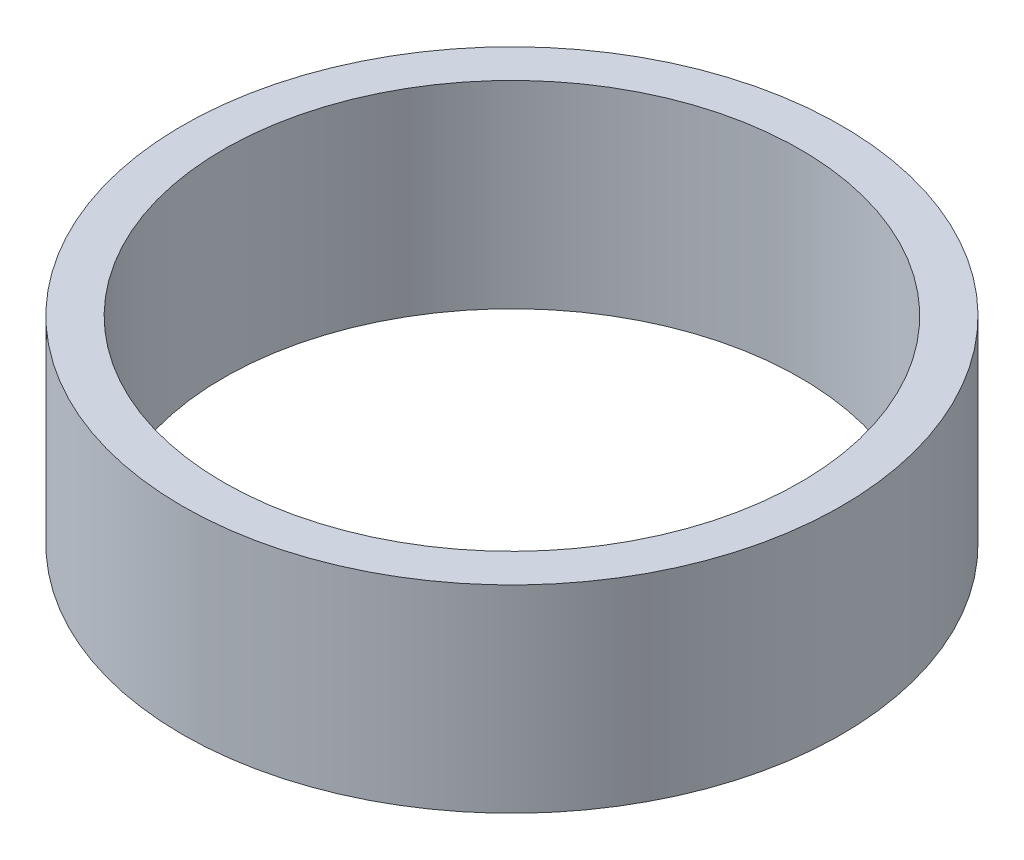
ISO-10303-21;
HEADER;
FILE_DESCRIPTION(('STEP AP214'),'2;1');
FILE_NAME('part.step','',(''),(''),'','','');
FILE_SCHEMA(('AUTOMOTIVE_DESIGN { 1 0 10303 214 1 1 1 1 }'));
ENDSEC;
DATA;
#1=APPLICATION_CONTEXT('core data for automotive mechanical design processes');
#2=APPLICATION_PROTOCOL_DEFINITION('international standard','automotive_design',2000,#1);
#3=PRODUCT_CONTEXT('',#1,'mechanical');
#4=PRODUCT('Part','Part','',(#3));
#5=PRODUCT_RELATED_PRODUCT_CATEGORY('part','',(#4));
#6=PRODUCT_DEFINITION_FORMATION('','',#4);
#7=PRODUCT_DEFINITION_CONTEXT('part definition',#1,'design');
#8=PRODUCT_DEFINITION('design','',#6,#7);
#9=PRODUCT_DEFINITION_SHAPE('','',#8);
#10=(LENGTH_UNIT() NAMED_UNIT(*) SI_UNIT(.MILLI.,.METRE.));
#11=(NAMED_UNIT(*) PLANE_ANGLE_UNIT() SI_UNIT($,.RADIAN.));
#12=(NAMED_UNIT(*) SI_UNIT($,.STERADIAN.) SOLID_ANGLE_UNIT());
#13=UNCERTAINTY_MEASURE_WITH_UNIT(LENGTH_MEASURE(1.E-05),#10,'distance_accuracy_value','');
#14=(GEOMETRIC_REPRESENTATION_CONTEXT(3) GLOBAL_UNCERTAINTY_ASSIGNED_CONTEXT((#13)) GLOBAL_UNIT_ASSIGNED_CONTEXT((#10,
#11,#12)) REPRESENTATION_CONTEXT('',''));
#15=CARTESIAN_POINT('',(0.,0.,0.));
#16=DIRECTION('',(0.,0.,1.));
#17=DIRECTION('',(1.,0.,0.));
#18=AXIS2_PLACEMENT_3D('',#15,#16,#17);
#19=CARTESIAN_POINT('',(0.,12.,0.));
#20=DIRECTION('',(0.,1.,0.));
#21=DIRECTION('',(0.,0.,1.));
#22=AXIS2_PLACEMENT_3D('',#19,#20,#21);
#23=PLANE('',#22);
#24=CARTESIAN_POINT('',(0.,12.,0.));
#25=DIRECTION('',(0.,1.,0.));
#26=DIRECTION('',(0.,0.,1.));
#27=AXIS2_PLACEMENT_3D('',#24,#25,#26);
#28=CIRCLE('',#27,20.);
#29=CARTESIAN_POINT('',(0.,12.,20.));
#30=VERTEX_POINT('',#29);
#31=EDGE_CURVE('E10',#30,#30,#28,.T.);
#32=ORIENTED_EDGE('',*,*,#31,.T.);
#33=EDGE_LOOP('',(#32));
#34=FACE_BOUND('',#33,.T.);
#35=CARTESIAN_POINT('',(0.,12.,0.));
#36=DIRECTION('',(0.,1.,0.));
#37=DIRECTION('',(0.,0.,1.));
#38=AXIS2_PLACEMENT_3D('',#35,#36,#37);
#39=CIRCLE('',#38,17.5);
#40=CARTESIAN_POINT('',(0.,12.,17.5));
#41=VERTEX_POINT('',#40);
#42=EDGE_CURVE('E50',#41,#41,#39,.T.);
#43=ORIENTED_EDGE('',*,*,#42,.F.);
#44=EDGE_LOOP('',(#43));
#45=FACE_BOUND('',#44,.T.);
#46=ADVANCED_FACE('F39',(#34,#45),#23,.T.);
#47=CARTESIAN_POINT('',(0.,0.,0.));
#48=DIRECTION('',(0.,1.,0.));
#49=DIRECTION('',(0.,0.,1.));
#50=AXIS2_PLACEMENT_3D('',#47,#48,#49);
#51=PLANE('',#50);
#52=CARTESIAN_POINT('',(0.,0.,0.));
#53=DIRECTION('',(0.,1.,0.));
#54=DIRECTION('',(0.,0.,1.));
#55=AXIS2_PLACEMENT_3D('',#52,#53,#54);
#56=CIRCLE('',#55,20.);
#57=CARTESIAN_POINT('',(0.,0.,20.));
#58=VERTEX_POINT('',#57);
#59=EDGE_CURVE('E43',#58,#58,#56,.T.);
#60=ORIENTED_EDGE('',*,*,#59,.F.);
#61=EDGE_LOOP('',(#60));
#62=FACE_BOUND('',#61,.T.);
#63=CARTESIAN_POINT('',(0.,0.,0.));
#64=DIRECTION('',(0.,1.,0.));
#65=DIRECTION('',(0.,0.,1.));
#66=AXIS2_PLACEMENT_3D('',#63,#64,#65);
#67=CIRCLE('',#66,17.5);
#68=CARTESIAN_POINT('',(0.,0.,17.5));
#69=VERTEX_POINT('',#68);
#70=EDGE_CURVE('E52',#69,#69,#67,.T.);
#71=ORIENTED_EDGE('',*,*,#70,.T.);
#72=EDGE_LOOP('',(#71));
#73=FACE_BOUND('',#72,.T.);
#74=ADVANCED_FACE('F62',(#62,#73),#51,.F.);
#75=CARTESIAN_POINT('',(0.,12.,0.));
#76=DIRECTION('',(0.,-1.,0.));
#77=DIRECTION('',(0.,0.,-1.));
#78=AXIS2_PLACEMENT_3D('',#75,#76,#77);
#79=CYLINDRICAL_SURFACE('',#78,20.);
#80=ORIENTED_EDGE('',*,*,#31,.F.);
#81=EDGE_LOOP('',(#80));
#82=FACE_BOUND('',#81,.T.);
#83=ORIENTED_EDGE('',*,*,#59,.T.);
#84=EDGE_LOOP('',(#83));
#85=FACE_BOUND('',#84,.T.);
#86=ADVANCED_FACE('F41',(#82,#85),#79,.T.);
#87=CARTESIAN_POINT('',(0.,12.,0.));
#88=DIRECTION('',(0.,-1.,0.));
#89=DIRECTION('',(0.,0.,-1.));
#90=AXIS2_PLACEMENT_3D('',#87,#88,#89);
#91=CYLINDRICAL_SURFACE('',#90,17.5);
#92=ORIENTED_EDGE('',*,*,#42,.T.);
#93=EDGE_LOOP('',(#92));
#94=FACE_BOUND('',#93,.T.);
#95=ORIENTED_EDGE('',*,*,#70,.F.);
#96=EDGE_LOOP('',(#95));
#97=FACE_BOUND('',#96,.T.);
#98=ADVANCED_FACE('F58',(#94,#97),#91,.F.);
#99=CLOSED_SHELL('',(#46,#74,#86,#98));
#100=MANIFOLD_SOLID_BREP('B2',#99);
#101=ADVANCED_BREP_SHAPE_REPRESENTATION('',(#18,#100),#14);
#102=SHAPE_DEFINITION_REPRESENTATION(#9,#101);
ENDSEC;
END-ISO-10303-21;
